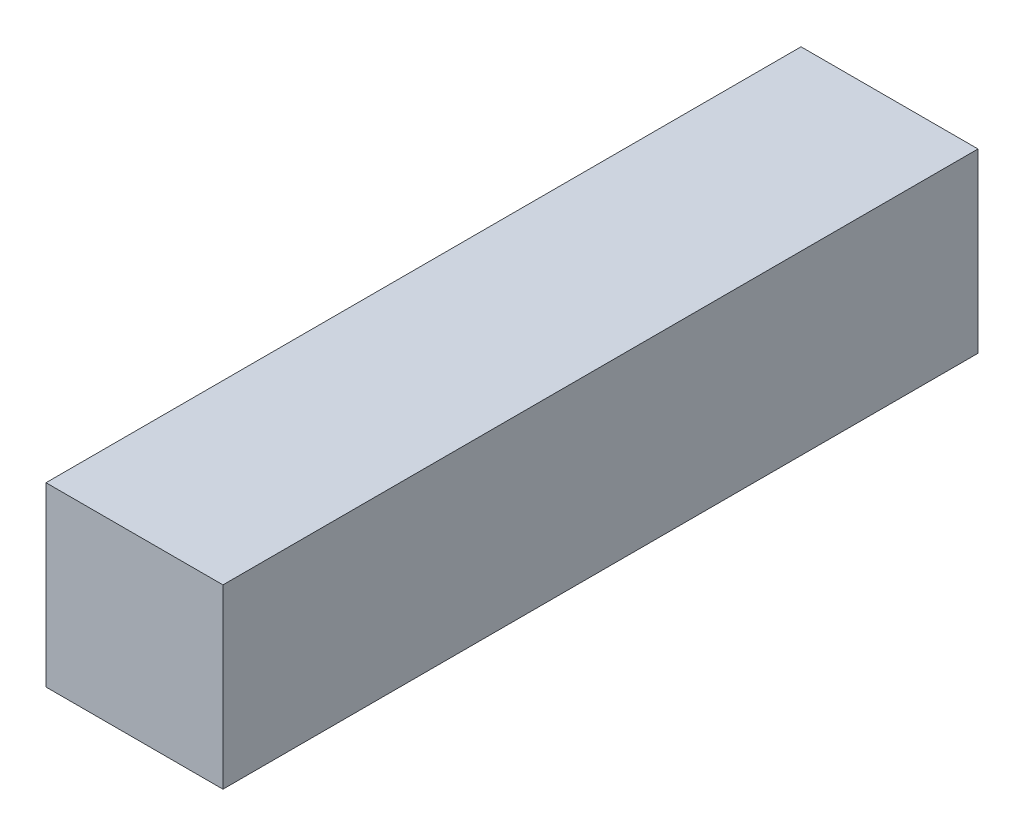
ISO-10303-21;
HEADER;
FILE_DESCRIPTION(('STEP AP214'),'2;1');
FILE_NAME('part.step','',(''),(''),'','','');
FILE_SCHEMA(('AUTOMOTIVE_DESIGN { 1 0 10303 214 1 1 1 1 }'));
ENDSEC;
DATA;
#1=APPLICATION_CONTEXT('core data for automotive mechanical design processes');
#2=APPLICATION_PROTOCOL_DEFINITION('international standard','automotive_design',2000,#1);
#3=PRODUCT_CONTEXT('',#1,'mechanical');
#4=PRODUCT('Part','Part','',(#3));
#5=PRODUCT_RELATED_PRODUCT_CATEGORY('part','',(#4));
#6=PRODUCT_DEFINITION_FORMATION('','',#4);
#7=PRODUCT_DEFINITION_CONTEXT('part definition',#1,'design');
#8=PRODUCT_DEFINITION('design','',#6,#7);
#9=PRODUCT_DEFINITION_SHAPE('','',#8);
#10=(LENGTH_UNIT() NAMED_UNIT(*) SI_UNIT(.MILLI.,.METRE.));
#11=(NAMED_UNIT(*) PLANE_ANGLE_UNIT() SI_UNIT($,.RADIAN.));
#12=(NAMED_UNIT(*) SI_UNIT($,.STERADIAN.) SOLID_ANGLE_UNIT());
#13=UNCERTAINTY_MEASURE_WITH_UNIT(LENGTH_MEASURE(1.E-05),#10,'distance_accuracy_value','');
#14=(GEOMETRIC_REPRESENTATION_CONTEXT(3) GLOBAL_UNCERTAINTY_ASSIGNED_CONTEXT((#13)) GLOBAL_UNIT_ASSIGNED_CONTEXT((#10,
#11,#12)) REPRESENTATION_CONTEXT('',''));
#15=CARTESIAN_POINT('',(0.,0.,0.));
#16=DIRECTION('',(0.,0.,1.));
#17=DIRECTION('',(1.,0.,0.));
#18=AXIS2_PLACEMENT_3D('',#15,#16,#17);
#19=CARTESIAN_POINT('',(-1.190625,-1.190625,152.4));
#20=DIRECTION('',(1.,0.,0.));
#21=DIRECTION('',(0.,1.,0.));
#22=AXIS2_PLACEMENT_3D('',#19,#20,#21);
#23=PLANE('',#22);
#24=DIRECTION('',(0.,0.,-1.));
#25=VECTOR('',#24,1.);
#26=CARTESIAN_POINT('',(-1.190625,1.190625,152.4));
#27=LINE('',#26,#25);
#28=CARTESIAN_POINT('',(-1.190625,1.190625,152.4));
#29=VERTEX_POINT('',#28);
#30=CARTESIAN_POINT('',(-1.190625,1.190625,142.24));
#31=VERTEX_POINT('',#30);
#32=EDGE_CURVE('E96',#29,#31,#27,.T.);
#33=ORIENTED_EDGE('',*,*,#32,.T.);
#34=DIRECTION('',(0.,-1.,0.));
#35=VECTOR('',#34,1.);
#36=CARTESIAN_POINT('',(-1.190625,-1.190625,142.24));
#37=LINE('',#36,#35);
#38=CARTESIAN_POINT('',(-1.190625,-1.190625,142.24));
#39=VERTEX_POINT('',#38);
#40=EDGE_CURVE('E55',#31,#39,#37,.T.);
#41=ORIENTED_EDGE('',*,*,#40,.T.);
#42=DIRECTION('',(0.,0.,-1.));
#43=VECTOR('',#42,1.);
#44=CARTESIAN_POINT('',(-1.190625,-1.190625,152.4));
#45=LINE('',#44,#43);
#46=CARTESIAN_POINT('',(-1.190625,-1.190625,152.4));
#47=VERTEX_POINT('',#46);
#48=EDGE_CURVE('E48',#47,#39,#45,.T.);
#49=ORIENTED_EDGE('',*,*,#48,.F.);
#50=DIRECTION('',(0.,-1.,0.));
#51=VECTOR('',#50,1.);
#52=CARTESIAN_POINT('',(-1.190625,-1.190625,152.4));
#53=LINE('',#52,#51);
#54=EDGE_CURVE('E108',#29,#47,#53,.T.);
#55=ORIENTED_EDGE('',*,*,#54,.F.);
#56=EDGE_LOOP('',(#33,#41,#49,#55));
#57=FACE_BOUND('',#56,.T.);
#58=ADVANCED_FACE('F41',(#57),#23,.F.);
#59=CARTESIAN_POINT('',(1.190625,-1.190625,152.4));
#60=DIRECTION('',(0.,1.,0.));
#61=DIRECTION('',(0.,0.,1.));
#62=AXIS2_PLACEMENT_3D('',#59,#60,#61);
#63=PLANE('',#62);
#64=ORIENTED_EDGE('',*,*,#48,.T.);
#65=DIRECTION('',(1.,0.,0.));
#66=VECTOR('',#65,1.);
#67=CARTESIAN_POINT('',(1.190625,-1.190625,142.24));
#68=LINE('',#67,#66);
#69=CARTESIAN_POINT('',(1.190625,-1.190625,142.24));
#70=VERTEX_POINT('',#69);
#71=EDGE_CURVE('E93',#39,#70,#68,.T.);
#72=ORIENTED_EDGE('',*,*,#71,.T.);
#73=DIRECTION('',(0.,0.,-1.));
#74=VECTOR('',#73,1.);
#75=CARTESIAN_POINT('',(1.190625,-1.190625,152.4));
#76=LINE('',#75,#74);
#77=CARTESIAN_POINT('',(1.190625,-1.190625,152.4));
#78=VERTEX_POINT('',#77);
#79=EDGE_CURVE('E92',#78,#70,#76,.T.);
#80=ORIENTED_EDGE('',*,*,#79,.F.);
#81=DIRECTION('',(1.,0.,0.));
#82=VECTOR('',#81,1.);
#83=CARTESIAN_POINT('',(1.190625,-1.190625,152.4));
#84=LINE('',#83,#82);
#85=EDGE_CURVE('E105',#47,#78,#84,.T.);
#86=ORIENTED_EDGE('',*,*,#85,.F.);
#87=EDGE_LOOP('',(#64,#72,#80,#86));
#88=FACE_BOUND('',#87,.T.);
#89=ADVANCED_FACE('F104',(#88),#63,.F.);
#90=CARTESIAN_POINT('',(1.190625,1.190625,152.4));
#91=DIRECTION('',(-1.,0.,0.));
#92=DIRECTION('',(0.,-1.,0.));
#93=AXIS2_PLACEMENT_3D('',#90,#91,#92);
#94=PLANE('',#93);
#95=ORIENTED_EDGE('',*,*,#79,.T.);
#96=DIRECTION('',(0.,1.,0.));
#97=VECTOR('',#96,1.);
#98=CARTESIAN_POINT('',(1.190625,1.190625,142.24));
#99=LINE('',#98,#97);
#100=CARTESIAN_POINT('',(1.190625,1.190625,142.24));
#101=VERTEX_POINT('',#100);
#102=EDGE_CURVE('E80',#70,#101,#99,.T.);
#103=ORIENTED_EDGE('',*,*,#102,.T.);
#104=DIRECTION('',(0.,0.,-1.));
#105=VECTOR('',#104,1.);
#106=CARTESIAN_POINT('',(1.190625,1.190625,152.4));
#107=LINE('',#106,#105);
#108=CARTESIAN_POINT('',(1.190625,1.190625,152.4));
#109=VERTEX_POINT('',#108);
#110=EDGE_CURVE('E90',#109,#101,#107,.T.);
#111=ORIENTED_EDGE('',*,*,#110,.F.);
#112=DIRECTION('',(0.,1.,0.));
#113=VECTOR('',#112,1.);
#114=CARTESIAN_POINT('',(1.190625,1.190625,152.4));
#115=LINE('',#114,#113);
#116=EDGE_CURVE('E114',#78,#109,#115,.T.);
#117=ORIENTED_EDGE('',*,*,#116,.F.);
#118=EDGE_LOOP('',(#95,#103,#111,#117));
#119=FACE_BOUND('',#118,.T.);
#120=ADVANCED_FACE('F88',(#119),#94,.F.);
#121=CARTESIAN_POINT('',(-1.190625,1.190625,152.4));
#122=DIRECTION('',(0.,-1.,0.));
#123=DIRECTION('',(0.,0.,-1.));
#124=AXIS2_PLACEMENT_3D('',#121,#122,#123);
#125=PLANE('',#124);
#126=ORIENTED_EDGE('',*,*,#110,.T.);
#127=DIRECTION('',(-1.,0.,0.));
#128=VECTOR('',#127,1.);
#129=CARTESIAN_POINT('',(-1.190625,1.190625,142.24));
#130=LINE('',#129,#128);
#131=EDGE_CURVE('E11',#101,#31,#130,.T.);
#132=ORIENTED_EDGE('',*,*,#131,.T.);
#133=ORIENTED_EDGE('',*,*,#32,.F.);
#134=DIRECTION('',(-1.,0.,0.));
#135=VECTOR('',#134,1.);
#136=CARTESIAN_POINT('',(-1.190625,1.190625,152.4));
#137=LINE('',#136,#135);
#138=EDGE_CURVE('E62',#109,#29,#137,.T.);
#139=ORIENTED_EDGE('',*,*,#138,.F.);
#140=EDGE_LOOP('',(#126,#132,#133,#139));
#141=FACE_BOUND('',#140,.T.);
#142=ADVANCED_FACE('F95',(#141),#125,.F.);
#143=CARTESIAN_POINT('',(0.,0.,152.4));
#144=DIRECTION('',(0.,0.,-1.));
#145=DIRECTION('',(-1.,0.,0.));
#146=AXIS2_PLACEMENT_3D('',#143,#144,#145);
#147=PLANE('',#146);
#148=ORIENTED_EDGE('',*,*,#54,.T.);
#149=ORIENTED_EDGE('',*,*,#85,.T.);
#150=ORIENTED_EDGE('',*,*,#116,.T.);
#151=ORIENTED_EDGE('',*,*,#138,.T.);
#152=EDGE_LOOP('',(#148,#149,#150,#151));
#153=FACE_BOUND('',#152,.T.);
#154=ADVANCED_FACE('F115',(#153),#147,.F.);
#155=CARTESIAN_POINT('',(0.,0.,142.24));
#156=DIRECTION('',(0.,0.,1.));
#157=DIRECTION('',(1.,0.,0.));
#158=AXIS2_PLACEMENT_3D('',#155,#156,#157);
#159=PLANE('',#158);
#160=ORIENTED_EDGE('',*,*,#131,.F.);
#161=ORIENTED_EDGE('',*,*,#102,.F.);
#162=ORIENTED_EDGE('',*,*,#71,.F.);
#163=ORIENTED_EDGE('',*,*,#40,.F.);
#164=EDGE_LOOP('',(#160,#161,#162,#163));
#165=FACE_BOUND('',#164,.T.);
#166=ADVANCED_FACE('F79',(#165),#159,.F.);
#167=CLOSED_SHELL('',(#58,#89,#120,#142,#154,#166));
#168=MANIFOLD_SOLID_BREP('B2',#167);
#169=ADVANCED_BREP_SHAPE_REPRESENTATION('',(#18,#168),#14);
#170=SHAPE_DEFINITION_REPRESENTATION(#9,#169);
ENDSEC;
END-ISO-10303-21;
